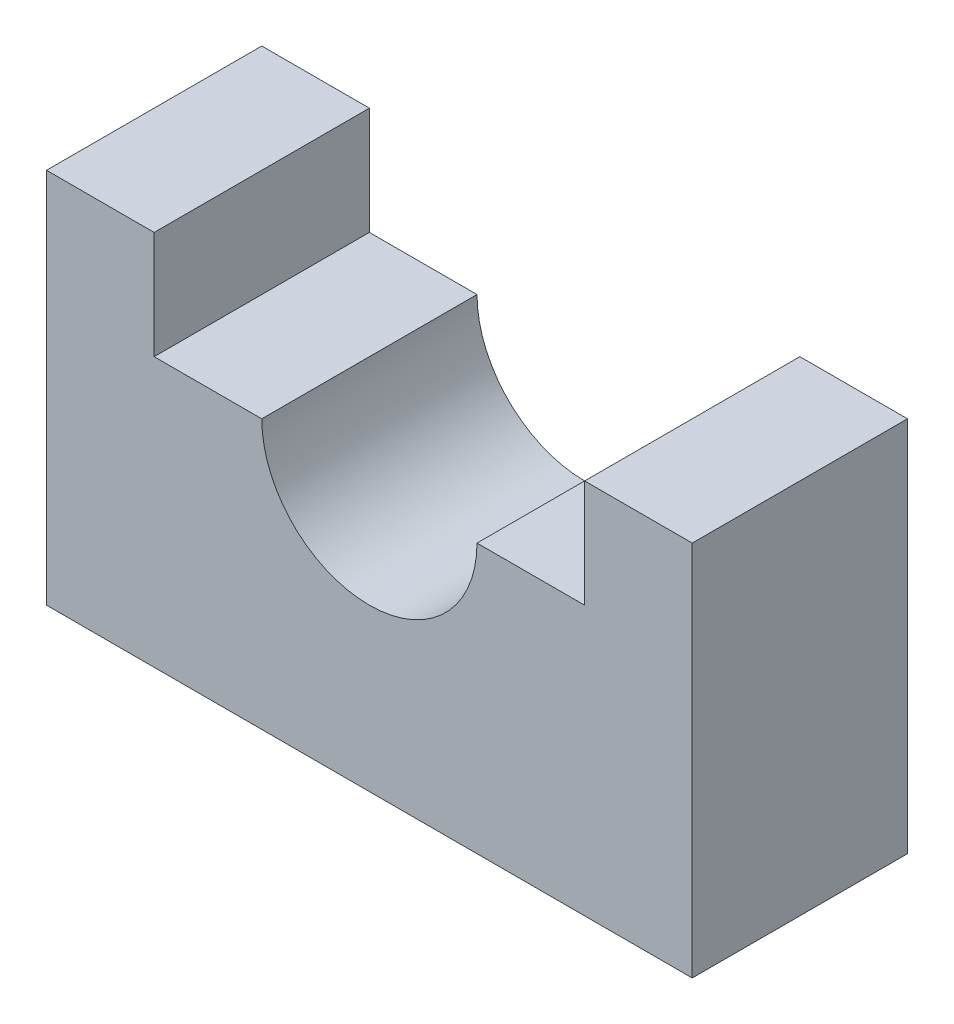
ISO-10303-21;
HEADER;
FILE_DESCRIPTION(('STEP AP214'),'2;1');
FILE_NAME('part.step','',(''),(''),'','','');
FILE_SCHEMA(('AUTOMOTIVE_DESIGN { 1 0 10303 214 1 1 1 1 }'));
ENDSEC;
DATA;
#1=APPLICATION_CONTEXT('core data for automotive mechanical design processes');
#2=APPLICATION_PROTOCOL_DEFINITION('international standard','automotive_design',2000,#1);
#3=PRODUCT_CONTEXT('',#1,'mechanical');
#4=PRODUCT('Part','Part','',(#3));
#5=PRODUCT_RELATED_PRODUCT_CATEGORY('part','',(#4));
#6=PRODUCT_DEFINITION_FORMATION('','',#4);
#7=PRODUCT_DEFINITION_CONTEXT('part definition',#1,'design');
#8=PRODUCT_DEFINITION('design','',#6,#7);
#9=PRODUCT_DEFINITION_SHAPE('','',#8);
#10=(LENGTH_UNIT() NAMED_UNIT(*) SI_UNIT(.MILLI.,.METRE.));
#11=(NAMED_UNIT(*) PLANE_ANGLE_UNIT() SI_UNIT($,.RADIAN.));
#12=(NAMED_UNIT(*) SI_UNIT($,.STERADIAN.) SOLID_ANGLE_UNIT());
#13=UNCERTAINTY_MEASURE_WITH_UNIT(LENGTH_MEASURE(1.E-05),#10,'distance_accuracy_value','');
#14=(GEOMETRIC_REPRESENTATION_CONTEXT(3) GLOBAL_UNCERTAINTY_ASSIGNED_CONTEXT((#13)) GLOBAL_UNIT_ASSIGNED_CONTEXT((#10,
#11,#12)) REPRESENTATION_CONTEXT('',''));
#15=CARTESIAN_POINT('',(0.,0.,0.));
#16=DIRECTION('',(0.,0.,1.));
#17=DIRECTION('',(1.,0.,0.));
#18=AXIS2_PLACEMENT_3D('',#15,#16,#17);
#19=CARTESIAN_POINT('',(30.,0.,20.));
#20=DIRECTION('',(-1.,0.,0.));
#21=DIRECTION('',(0.,0.,1.));
#22=AXIS2_PLACEMENT_3D('',#19,#20,#21);
#23=PLANE('',#22);
#24=DIRECTION('',(0.,1.,0.));
#25=VECTOR('',#24,1.);
#26=CARTESIAN_POINT('',(30.,0.,0.));
#27=LINE('',#26,#25);
#28=CARTESIAN_POINT('',(30.,0.,0.));
#29=VERTEX_POINT('',#28);
#30=CARTESIAN_POINT('',(30.,35.,0.));
#31=VERTEX_POINT('',#30);
#32=EDGE_CURVE('E156',#29,#31,#27,.T.);
#33=ORIENTED_EDGE('',*,*,#32,.T.);
#34=DIRECTION('',(0.,0.,-1.));
#35=VECTOR('',#34,1.);
#36=CARTESIAN_POINT('',(30.,35.,20.));
#37=LINE('',#36,#35);
#38=CARTESIAN_POINT('',(30.,35.,20.));
#39=VERTEX_POINT('',#38);
#40=EDGE_CURVE('E11',#39,#31,#37,.T.);
#41=ORIENTED_EDGE('',*,*,#40,.F.);
#42=DIRECTION('',(0.,1.,0.));
#43=VECTOR('',#42,1.);
#44=CARTESIAN_POINT('',(30.,0.,20.));
#45=LINE('',#44,#43);
#46=CARTESIAN_POINT('',(30.,0.,20.));
#47=VERTEX_POINT('',#46);
#48=EDGE_CURVE('E184',#47,#39,#45,.T.);
#49=ORIENTED_EDGE('',*,*,#48,.F.);
#50=DIRECTION('',(0.,0.,-1.));
#51=VECTOR('',#50,1.);
#52=CARTESIAN_POINT('',(30.,0.,20.));
#53=LINE('',#52,#51);
#54=EDGE_CURVE('E152',#47,#29,#53,.T.);
#55=ORIENTED_EDGE('',*,*,#54,.T.);
#56=EDGE_LOOP('',(#33,#41,#49,#55));
#57=FACE_BOUND('',#56,.T.);
#58=ADVANCED_FACE('F43',(#57),#23,.F.);
#59=CARTESIAN_POINT('',(30.,35.,20.));
#60=DIRECTION('',(0.,-1.,0.));
#61=DIRECTION('',(0.,0.,-1.));
#62=AXIS2_PLACEMENT_3D('',#59,#60,#61);
#63=PLANE('',#62);
#64=DIRECTION('',(-1.,0.,0.));
#65=VECTOR('',#64,1.);
#66=CARTESIAN_POINT('',(30.,35.,0.));
#67=LINE('',#66,#65);
#68=CARTESIAN_POINT('',(20.,35.,0.));
#69=VERTEX_POINT('',#68);
#70=EDGE_CURVE('E160',#31,#69,#67,.T.);
#71=ORIENTED_EDGE('',*,*,#70,.T.);
#72=DIRECTION('',(0.,0.,-1.));
#73=VECTOR('',#72,1.);
#74=CARTESIAN_POINT('',(20.,35.,20.));
#75=LINE('',#74,#73);
#76=CARTESIAN_POINT('',(20.,35.,20.));
#77=VERTEX_POINT('',#76);
#78=EDGE_CURVE('E52',#77,#69,#75,.T.);
#79=ORIENTED_EDGE('',*,*,#78,.F.);
#80=DIRECTION('',(-1.,0.,0.));
#81=VECTOR('',#80,1.);
#82=CARTESIAN_POINT('',(30.,35.,20.));
#83=LINE('',#82,#81);
#84=EDGE_CURVE('E109',#39,#77,#83,.T.);
#85=ORIENTED_EDGE('',*,*,#84,.F.);
#86=ORIENTED_EDGE('',*,*,#40,.T.);
#87=EDGE_LOOP('',(#71,#79,#85,#86));
#88=FACE_BOUND('',#87,.T.);
#89=ADVANCED_FACE('F248',(#88),#63,.F.);
#90=CARTESIAN_POINT('',(20.,35.,20.));
#91=DIRECTION('',(1.,0.,0.));
#92=DIRECTION('',(0.,0.,-1.));
#93=AXIS2_PLACEMENT_3D('',#90,#91,#92);
#94=PLANE('',#93);
#95=DIRECTION('',(0.,-1.,0.));
#96=VECTOR('',#95,1.);
#97=CARTESIAN_POINT('',(20.,35.,0.));
#98=LINE('',#97,#96);
#99=CARTESIAN_POINT('',(20.,25.,0.));
#100=VERTEX_POINT('',#99);
#101=EDGE_CURVE('E163',#69,#100,#98,.T.);
#102=ORIENTED_EDGE('',*,*,#101,.T.);
#103=DIRECTION('',(0.,0.,-1.));
#104=VECTOR('',#103,1.);
#105=CARTESIAN_POINT('',(20.,25.,20.));
#106=LINE('',#105,#104);
#107=CARTESIAN_POINT('',(20.,25.,20.));
#108=VERTEX_POINT('',#107);
#109=EDGE_CURVE('E203',#108,#100,#106,.T.);
#110=ORIENTED_EDGE('',*,*,#109,.F.);
#111=DIRECTION('',(0.,-1.,0.));
#112=VECTOR('',#111,1.);
#113=CARTESIAN_POINT('',(20.,35.,20.));
#114=LINE('',#113,#112);
#115=EDGE_CURVE('E213',#77,#108,#114,.T.);
#116=ORIENTED_EDGE('',*,*,#115,.F.);
#117=ORIENTED_EDGE('',*,*,#78,.T.);
#118=EDGE_LOOP('',(#102,#110,#116,#117));
#119=FACE_BOUND('',#118,.T.);
#120=ADVANCED_FACE('F211',(#119),#94,.F.);
#121=CARTESIAN_POINT('',(20.,25.,20.));
#122=DIRECTION('',(0.,-1.,0.));
#123=DIRECTION('',(0.,0.,-1.));
#124=AXIS2_PLACEMENT_3D('',#121,#122,#123);
#125=PLANE('',#124);
#126=DIRECTION('',(-1.,0.,0.));
#127=VECTOR('',#126,1.);
#128=CARTESIAN_POINT('',(20.,25.,0.));
#129=LINE('',#128,#127);
#130=CARTESIAN_POINT('',(10.,25.,0.));
#131=VERTEX_POINT('',#130);
#132=EDGE_CURVE('E166',#100,#131,#129,.T.);
#133=ORIENTED_EDGE('',*,*,#132,.T.);
#134=DIRECTION('',(0.,0.,-1.));
#135=VECTOR('',#134,1.);
#136=CARTESIAN_POINT('',(10.,25.,20.));
#137=LINE('',#136,#135);
#138=CARTESIAN_POINT('',(10.,25.,20.));
#139=VERTEX_POINT('',#138);
#140=EDGE_CURVE('E199',#139,#131,#137,.T.);
#141=ORIENTED_EDGE('',*,*,#140,.F.);
#142=DIRECTION('',(-1.,0.,0.));
#143=VECTOR('',#142,1.);
#144=CARTESIAN_POINT('',(20.,25.,20.));
#145=LINE('',#144,#143);
#146=EDGE_CURVE('E232',#108,#139,#145,.T.);
#147=ORIENTED_EDGE('',*,*,#146,.F.);
#148=ORIENTED_EDGE('',*,*,#109,.T.);
#149=EDGE_LOOP('',(#133,#141,#147,#148));
#150=FACE_BOUND('',#149,.T.);
#151=ADVANCED_FACE('F222',(#150),#125,.F.);
#152=CARTESIAN_POINT('',(0.,25.,20.));
#153=DIRECTION('',(0.,0.,-1.));
#154=DIRECTION('',(-1.,0.,0.));
#155=AXIS2_PLACEMENT_3D('',#152,#153,#154);
#156=CYLINDRICAL_SURFACE('',#155,10.);
#157=CARTESIAN_POINT('',(0.,25.,0.));
#158=DIRECTION('',(0.,0.,-1.));
#159=DIRECTION('',(1.,0.,0.));
#160=AXIS2_PLACEMENT_3D('',#157,#158,#159);
#161=CIRCLE('',#160,10.);
#162=CARTESIAN_POINT('',(-10.,25.,0.));
#163=VERTEX_POINT('',#162);
#164=EDGE_CURVE('E169',#131,#163,#161,.T.);
#165=ORIENTED_EDGE('',*,*,#164,.T.);
#166=DIRECTION('',(0.,0.,-1.));
#167=VECTOR('',#166,1.);
#168=CARTESIAN_POINT('',(-10.,25.,20.));
#169=LINE('',#168,#167);
#170=CARTESIAN_POINT('',(-10.,25.,20.));
#171=VERTEX_POINT('',#170);
#172=EDGE_CURVE('E195',#171,#163,#169,.T.);
#173=ORIENTED_EDGE('',*,*,#172,.F.);
#174=CARTESIAN_POINT('',(0.,25.,20.));
#175=DIRECTION('',(0.,0.,-1.));
#176=DIRECTION('',(1.,0.,0.));
#177=AXIS2_PLACEMENT_3D('',#174,#175,#176);
#178=CIRCLE('',#177,10.);
#179=EDGE_CURVE('E228',#139,#171,#178,.T.);
#180=ORIENTED_EDGE('',*,*,#179,.F.);
#181=ORIENTED_EDGE('',*,*,#140,.T.);
#182=EDGE_LOOP('',(#165,#173,#180,#181));
#183=FACE_BOUND('',#182,.T.);
#184=ADVANCED_FACE('F226',(#183),#156,.F.);
#185=CARTESIAN_POINT('',(-20.,25.,20.));
#186=DIRECTION('',(0.,-1.,0.));
#187=DIRECTION('',(0.,0.,-1.));
#188=AXIS2_PLACEMENT_3D('',#185,#186,#187);
#189=PLANE('',#188);
#190=DIRECTION('',(-1.,0.,0.));
#191=VECTOR('',#190,1.);
#192=CARTESIAN_POINT('',(-20.,25.,0.));
#193=LINE('',#192,#191);
#194=CARTESIAN_POINT('',(-20.,25.,0.));
#195=VERTEX_POINT('',#194);
#196=EDGE_CURVE('E172',#163,#195,#193,.T.);
#197=ORIENTED_EDGE('',*,*,#196,.T.);
#198=DIRECTION('',(0.,0.,-1.));
#199=VECTOR('',#198,1.);
#200=CARTESIAN_POINT('',(-20.,25.,20.));
#201=LINE('',#200,#199);
#202=CARTESIAN_POINT('',(-20.,25.,20.));
#203=VERTEX_POINT('',#202);
#204=EDGE_CURVE('E191',#203,#195,#201,.T.);
#205=ORIENTED_EDGE('',*,*,#204,.F.);
#206=DIRECTION('',(-1.,0.,0.));
#207=VECTOR('',#206,1.);
#208=CARTESIAN_POINT('',(-20.,25.,20.));
#209=LINE('',#208,#207);
#210=EDGE_CURVE('E231',#171,#203,#209,.T.);
#211=ORIENTED_EDGE('',*,*,#210,.F.);
#212=ORIENTED_EDGE('',*,*,#172,.T.);
#213=EDGE_LOOP('',(#197,#205,#211,#212));
#214=FACE_BOUND('',#213,.T.);
#215=ADVANCED_FACE('F260',(#214),#189,.F.);
#216=CARTESIAN_POINT('',(-20.,35.,20.));
#217=DIRECTION('',(-1.,0.,0.));
#218=DIRECTION('',(0.,0.,1.));
#219=AXIS2_PLACEMENT_3D('',#216,#217,#218);
#220=PLANE('',#219);
#221=DIRECTION('',(0.,1.,0.));
#222=VECTOR('',#221,1.);
#223=CARTESIAN_POINT('',(-20.,35.,0.));
#224=LINE('',#223,#222);
#225=CARTESIAN_POINT('',(-20.,35.,0.));
#226=VERTEX_POINT('',#225);
#227=EDGE_CURVE('E175',#195,#226,#224,.T.);
#228=ORIENTED_EDGE('',*,*,#227,.T.);
#229=DIRECTION('',(0.,0.,-1.));
#230=VECTOR('',#229,1.);
#231=CARTESIAN_POINT('',(-20.,35.,20.));
#232=LINE('',#231,#230);
#233=CARTESIAN_POINT('',(-20.,35.,20.));
#234=VERTEX_POINT('',#233);
#235=EDGE_CURVE('E145',#234,#226,#232,.T.);
#236=ORIENTED_EDGE('',*,*,#235,.F.);
#237=DIRECTION('',(0.,1.,0.));
#238=VECTOR('',#237,1.);
#239=CARTESIAN_POINT('',(-20.,35.,20.));
#240=LINE('',#239,#238);
#241=EDGE_CURVE('E134',#203,#234,#240,.T.);
#242=ORIENTED_EDGE('',*,*,#241,.F.);
#243=ORIENTED_EDGE('',*,*,#204,.T.);
#244=EDGE_LOOP('',(#228,#236,#242,#243));
#245=FACE_BOUND('',#244,.T.);
#246=ADVANCED_FACE('F263',(#245),#220,.F.);
#247=CARTESIAN_POINT('',(-30.,35.,20.));
#248=DIRECTION('',(0.,-1.,0.));
#249=DIRECTION('',(0.,0.,-1.));
#250=AXIS2_PLACEMENT_3D('',#247,#248,#249);
#251=PLANE('',#250);
#252=DIRECTION('',(-1.,0.,0.));
#253=VECTOR('',#252,1.);
#254=CARTESIAN_POINT('',(-30.,35.,0.));
#255=LINE('',#254,#253);
#256=CARTESIAN_POINT('',(-30.,35.,0.));
#257=VERTEX_POINT('',#256);
#258=EDGE_CURVE('E143',#226,#257,#255,.T.);
#259=ORIENTED_EDGE('',*,*,#258,.T.);
#260=DIRECTION('',(0.,0.,-1.));
#261=VECTOR('',#260,1.);
#262=CARTESIAN_POINT('',(-30.,35.,20.));
#263=LINE('',#262,#261);
#264=CARTESIAN_POINT('',(-30.,35.,20.));
#265=VERTEX_POINT('',#264);
#266=EDGE_CURVE('E140',#265,#257,#263,.T.);
#267=ORIENTED_EDGE('',*,*,#266,.F.);
#268=DIRECTION('',(-1.,0.,0.));
#269=VECTOR('',#268,1.);
#270=CARTESIAN_POINT('',(-30.,35.,20.));
#271=LINE('',#270,#269);
#272=EDGE_CURVE('E128',#234,#265,#271,.T.);
#273=ORIENTED_EDGE('',*,*,#272,.F.);
#274=ORIENTED_EDGE('',*,*,#235,.T.);
#275=EDGE_LOOP('',(#259,#267,#273,#274));
#276=FACE_BOUND('',#275,.T.);
#277=ADVANCED_FACE('F141',(#276),#251,.F.);
#278=CARTESIAN_POINT('',(-30.,0.,20.));
#279=DIRECTION('',(1.,0.,0.));
#280=DIRECTION('',(0.,0.,-1.));
#281=AXIS2_PLACEMENT_3D('',#278,#279,#280);
#282=PLANE('',#281);
#283=DIRECTION('',(0.,-1.,0.));
#284=VECTOR('',#283,1.);
#285=CARTESIAN_POINT('',(-30.,0.,0.));
#286=LINE('',#285,#284);
#287=CARTESIAN_POINT('',(-30.,0.,0.));
#288=VERTEX_POINT('',#287);
#289=EDGE_CURVE('E95',#257,#288,#286,.T.);
#290=ORIENTED_EDGE('',*,*,#289,.T.);
#291=DIRECTION('',(0.,0.,-1.));
#292=VECTOR('',#291,1.);
#293=CARTESIAN_POINT('',(-30.,0.,20.));
#294=LINE('',#293,#292);
#295=CARTESIAN_POINT('',(-30.,0.,20.));
#296=VERTEX_POINT('',#295);
#297=EDGE_CURVE('E146',#296,#288,#294,.T.);
#298=ORIENTED_EDGE('',*,*,#297,.F.);
#299=DIRECTION('',(0.,-1.,0.));
#300=VECTOR('',#299,1.);
#301=CARTESIAN_POINT('',(-30.,0.,20.));
#302=LINE('',#301,#300);
#303=EDGE_CURVE('E132',#265,#296,#302,.T.);
#304=ORIENTED_EDGE('',*,*,#303,.F.);
#305=ORIENTED_EDGE('',*,*,#266,.T.);
#306=EDGE_LOOP('',(#290,#298,#304,#305));
#307=FACE_BOUND('',#306,.T.);
#308=ADVANCED_FACE('F148',(#307),#282,.F.);
#309=CARTESIAN_POINT('',(-30.,0.,20.));
#310=DIRECTION('',(0.,1.,0.));
#311=DIRECTION('',(0.,0.,1.));
#312=AXIS2_PLACEMENT_3D('',#309,#310,#311);
#313=PLANE('',#312);
#314=DIRECTION('',(1.,0.,0.));
#315=VECTOR('',#314,1.);
#316=CARTESIAN_POINT('',(-30.,0.,0.));
#317=LINE('',#316,#315);
#318=EDGE_CURVE('E101',#288,#29,#317,.T.);
#319=ORIENTED_EDGE('',*,*,#318,.T.);
#320=ORIENTED_EDGE('',*,*,#54,.F.);
#321=DIRECTION('',(1.,0.,0.));
#322=VECTOR('',#321,1.);
#323=CARTESIAN_POINT('',(-30.,0.,20.));
#324=LINE('',#323,#322);
#325=EDGE_CURVE('E60',#296,#47,#324,.T.);
#326=ORIENTED_EDGE('',*,*,#325,.F.);
#327=ORIENTED_EDGE('',*,*,#297,.T.);
#328=EDGE_LOOP('',(#319,#320,#326,#327));
#329=FACE_BOUND('',#328,.T.);
#330=ADVANCED_FACE('F272',(#329),#313,.F.);
#331=CARTESIAN_POINT('',(0.,25.,20.));
#332=DIRECTION('',(0.,0.,1.));
#333=DIRECTION('',(1.,0.,0.));
#334=AXIS2_PLACEMENT_3D('',#331,#332,#333);
#335=PLANE('',#334);
#336=ORIENTED_EDGE('',*,*,#48,.T.);
#337=ORIENTED_EDGE('',*,*,#84,.T.);
#338=ORIENTED_EDGE('',*,*,#115,.T.);
#339=ORIENTED_EDGE('',*,*,#146,.T.);
#340=ORIENTED_EDGE('',*,*,#179,.T.);
#341=ORIENTED_EDGE('',*,*,#210,.T.);
#342=ORIENTED_EDGE('',*,*,#241,.T.);
#343=ORIENTED_EDGE('',*,*,#272,.T.);
#344=ORIENTED_EDGE('',*,*,#303,.T.);
#345=ORIENTED_EDGE('',*,*,#325,.T.);
#346=EDGE_LOOP('',(#336,#337,#338,#339,#340,#341,#342,#343,#344,#345));
#347=FACE_BOUND('',#346,.T.);
#348=ADVANCED_FACE('F130',(#347),#335,.T.);
#349=CARTESIAN_POINT('',(0.,25.,0.));
#350=DIRECTION('',(0.,0.,1.));
#351=DIRECTION('',(1.,0.,0.));
#352=AXIS2_PLACEMENT_3D('',#349,#350,#351);
#353=PLANE('',#352);
#354=ORIENTED_EDGE('',*,*,#32,.F.);
#355=ORIENTED_EDGE('',*,*,#318,.F.);
#356=ORIENTED_EDGE('',*,*,#289,.F.);
#357=ORIENTED_EDGE('',*,*,#258,.F.);
#358=ORIENTED_EDGE('',*,*,#227,.F.);
#359=ORIENTED_EDGE('',*,*,#196,.F.);
#360=ORIENTED_EDGE('',*,*,#164,.F.);
#361=ORIENTED_EDGE('',*,*,#132,.F.);
#362=ORIENTED_EDGE('',*,*,#101,.F.);
#363=ORIENTED_EDGE('',*,*,#70,.F.);
#364=EDGE_LOOP('',(#354,#355,#356,#357,#358,#359,#360,#361,#362,#363));
#365=FACE_BOUND('',#364,.T.);
#366=ADVANCED_FACE('F217',(#365),#353,.F.);
#367=CLOSED_SHELL('',(#58,#89,#120,#151,#184,#215,#246,#277,#308,#330,#348,#366));
#368=MANIFOLD_SOLID_BREP('B2',#367);
#369=ADVANCED_BREP_SHAPE_REPRESENTATION('',(#18,#368),#14);
#370=SHAPE_DEFINITION_REPRESENTATION(#9,#369);
ENDSEC;
END-ISO-10303-21;
